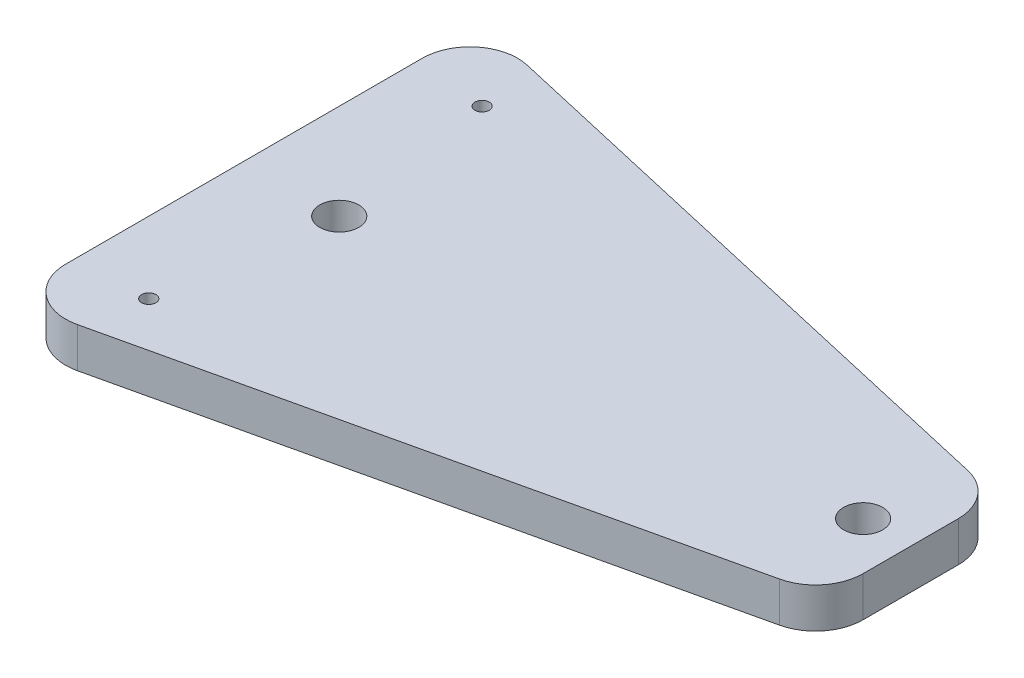
ISO-10303-21;
HEADER;
FILE_DESCRIPTION(('STEP AP214'),'2;1');
FILE_NAME('part.step','',(''),(''),'','','');
FILE_SCHEMA(('AUTOMOTIVE_DESIGN { 1 0 10303 214 1 1 1 1 }'));
ENDSEC;
DATA;
#1=APPLICATION_CONTEXT('core data for automotive mechanical design processes');
#2=APPLICATION_PROTOCOL_DEFINITION('international standard','automotive_design',2000,#1);
#3=PRODUCT_CONTEXT('',#1,'mechanical');
#4=PRODUCT('Part','Part','',(#3));
#5=PRODUCT_RELATED_PRODUCT_CATEGORY('part','',(#4));
#6=PRODUCT_DEFINITION_FORMATION('','',#4);
#7=PRODUCT_DEFINITION_CONTEXT('part definition',#1,'design');
#8=PRODUCT_DEFINITION('design','',#6,#7);
#9=PRODUCT_DEFINITION_SHAPE('','',#8);
#10=(LENGTH_UNIT() NAMED_UNIT(*) SI_UNIT(.MILLI.,.METRE.));
#11=(NAMED_UNIT(*) PLANE_ANGLE_UNIT() SI_UNIT($,.RADIAN.));
#12=(NAMED_UNIT(*) SI_UNIT($,.STERADIAN.) SOLID_ANGLE_UNIT());
#13=UNCERTAINTY_MEASURE_WITH_UNIT(LENGTH_MEASURE(1.E-05),#10,'distance_accuracy_value','');
#14=(GEOMETRIC_REPRESENTATION_CONTEXT(3) GLOBAL_UNCERTAINTY_ASSIGNED_CONTEXT((#13)) GLOBAL_UNIT_ASSIGNED_CONTEXT((#10,
#11,#12)) REPRESENTATION_CONTEXT('',''));
#15=CARTESIAN_POINT('',(0.,0.,0.));
#16=DIRECTION('',(0.,0.,1.));
#17=DIRECTION('',(1.,0.,0.));
#18=AXIS2_PLACEMENT_3D('',#15,#16,#17);
#19=CARTESIAN_POINT('',(27.0142215577712,8.4,-10.));
#20=DIRECTION('',(0.,-1.,0.));
#21=DIRECTION('',(0.,0.,-1.));
#22=AXIS2_PLACEMENT_3D('',#19,#20,#21);
#23=PLANE('',#22);
#24=CARTESIAN_POINT('',(27.0142215577712,8.4,-10.));
#25=DIRECTION('',(0.,1.,0.));
#26=DIRECTION('',(0.,0.,-1.));
#27=AXIS2_PLACEMENT_3D('',#24,#25,#26);
#28=CIRCLE('',#27,9.99999999999999);
#29=CARTESIAN_POINT('',(37.0142215577712,8.4,-10.));
#30=VERTEX_POINT('',#29);
#31=CARTESIAN_POINT('',(29.2444183072308,8.4,-19.7481394357436));
#32=VERTEX_POINT('',#31);
#33=EDGE_CURVE('E238',#30,#32,#28,.T.);
#34=ORIENTED_EDGE('',*,*,#33,.T.);
#35=DIRECTION('',(-0.974813943574362,0.,-0.223019674945958));
#36=VECTOR('',#35,1.);
#37=CARTESIAN_POINT('',(-90.7555816927692,8.4,-47.2019537455647));
#38=LINE('',#37,#36);
#39=CARTESIAN_POINT('',(-90.7555816927692,8.4,-47.2019537455647));
#40=VERTEX_POINT('',#39);
#41=EDGE_CURVE('E241',#32,#40,#38,.T.);
#42=ORIENTED_EDGE('',*,*,#41,.T.);
#43=CARTESIAN_POINT('',(-92.9857784422288,8.4,-37.453814309821));
#44=DIRECTION('',(0.,1.,0.));
#45=DIRECTION('',(0.,0.,-1.));
#46=AXIS2_PLACEMENT_3D('',#43,#44,#45);
#47=CIRCLE('',#46,10.);
#48=CARTESIAN_POINT('',(-102.985778442229,8.4,-37.453814309821));
#49=VERTEX_POINT('',#48);
#50=EDGE_CURVE('E244',#40,#49,#47,.T.);
#51=ORIENTED_EDGE('',*,*,#50,.T.);
#52=DIRECTION('',(0.,0.,1.));
#53=VECTOR('',#52,1.);
#54=CARTESIAN_POINT('',(-102.985778442229,8.4,37.453814309821));
#55=LINE('',#54,#53);
#56=CARTESIAN_POINT('',(-102.985778442229,8.4,37.453814309821));
#57=VERTEX_POINT('',#56);
#58=EDGE_CURVE('E246',#49,#57,#55,.T.);
#59=ORIENTED_EDGE('',*,*,#58,.T.);
#60=CARTESIAN_POINT('',(-92.9857784422288,8.4,37.453814309821));
#61=DIRECTION('',(0.,1.,0.));
#62=DIRECTION('',(0.,0.,-1.));
#63=AXIS2_PLACEMENT_3D('',#60,#61,#62);
#64=CIRCLE('',#63,10.);
#65=CARTESIAN_POINT('',(-90.7555816927692,8.4,47.2019537455647));
#66=VERTEX_POINT('',#65);
#67=EDGE_CURVE('E248',#57,#66,#64,.T.);
#68=ORIENTED_EDGE('',*,*,#67,.T.);
#69=DIRECTION('',(0.974813943574362,0.,-0.223019674945958));
#70=VECTOR('',#69,1.);
#71=CARTESIAN_POINT('',(-90.7555816927692,8.4,47.2019537455647));
#72=LINE('',#71,#70);
#73=CARTESIAN_POINT('',(29.2444183072308,8.4,19.7481394357436));
#74=VERTEX_POINT('',#73);
#75=EDGE_CURVE('E250',#66,#74,#72,.T.);
#76=ORIENTED_EDGE('',*,*,#75,.T.);
#77=CARTESIAN_POINT('',(27.0142215577712,8.4,10.));
#78=DIRECTION('',(0.,1.,0.));
#79=DIRECTION('',(0.,0.,1.));
#80=AXIS2_PLACEMENT_3D('',#77,#78,#79);
#81=CIRCLE('',#80,9.99999999999999);
#82=CARTESIAN_POINT('',(37.0142215577712,8.4,10.));
#83=VERTEX_POINT('',#82);
#84=EDGE_CURVE('E252',#74,#83,#81,.T.);
#85=ORIENTED_EDGE('',*,*,#84,.T.);
#86=DIRECTION('',(0.,0.,-1.));
#87=VECTOR('',#86,1.);
#88=CARTESIAN_POINT('',(37.0142215577712,8.4,10.));
#89=LINE('',#88,#87);
#90=EDGE_CURVE('E254',#83,#30,#89,.T.);
#91=ORIENTED_EDGE('',*,*,#90,.T.);
#92=EDGE_LOOP('',(#34,#42,#51,#59,#68,#76,#85,#91));
#93=FACE_BOUND('',#92,.T.);
#94=CARTESIAN_POINT('',(-82.9857784422288,8.4,0.));
#95=DIRECTION('',(0.,1.,0.));
#96=DIRECTION('',(0.,0.,1.));
#97=AXIS2_PLACEMENT_3D('',#94,#95,#96);
#98=CIRCLE('',#97,4.1);
#99=CARTESIAN_POINT('',(-82.9857784422288,8.4,4.1));
#100=VERTEX_POINT('',#99);
#101=EDGE_CURVE('E232',#100,#100,#98,.T.);
#102=ORIENTED_EDGE('',*,*,#101,.F.);
#103=EDGE_LOOP('',(#102));
#104=FACE_BOUND('',#103,.T.);
#105=CARTESIAN_POINT('',(27.0142215577712,8.4,0.));
#106=DIRECTION('',(0.,1.,0.));
#107=DIRECTION('',(0.,0.,1.));
#108=AXIS2_PLACEMENT_3D('',#105,#106,#107);
#109=CIRCLE('',#108,4.1);
#110=CARTESIAN_POINT('',(27.0142215577712,8.4,4.1));
#111=VERTEX_POINT('',#110);
#112=EDGE_CURVE('E226',#111,#111,#109,.T.);
#113=ORIENTED_EDGE('',*,*,#112,.F.);
#114=EDGE_LOOP('',(#113));
#115=FACE_BOUND('',#114,.T.);
#116=CARTESIAN_POINT('',(-87.9857784422288,8.4,35.));
#117=DIRECTION('',(0.,1.,0.));
#118=DIRECTION('',(0.,0.,1.));
#119=AXIS2_PLACEMENT_3D('',#116,#117,#118);
#120=CIRCLE('',#119,1.5);
#121=CARTESIAN_POINT('',(-87.9857784422288,8.4,36.5));
#122=VERTEX_POINT('',#121);
#123=EDGE_CURVE('E222',#122,#122,#120,.T.);
#124=ORIENTED_EDGE('',*,*,#123,.F.);
#125=EDGE_LOOP('',(#124));
#126=FACE_BOUND('',#125,.T.);
#127=CARTESIAN_POINT('',(-87.9857784422288,8.4,-35.));
#128=DIRECTION('',(0.,1.,0.));
#129=DIRECTION('',(0.,0.,1.));
#130=AXIS2_PLACEMENT_3D('',#127,#128,#129);
#131=CIRCLE('',#130,1.5);
#132=CARTESIAN_POINT('',(-87.9857784422288,8.4,-33.5));
#133=VERTEX_POINT('',#132);
#134=EDGE_CURVE('E219',#133,#133,#131,.T.);
#135=ORIENTED_EDGE('',*,*,#134,.F.);
#136=EDGE_LOOP('',(#135));
#137=FACE_BOUND('',#136,.T.);
#138=ADVANCED_FACE('F35',(#93,#104,#115,#126,#137),#23,.F.);
#139=CARTESIAN_POINT('',(27.0142215577712,0.,-10.));
#140=DIRECTION('',(0.,-1.,0.));
#141=DIRECTION('',(0.,0.,-1.));
#142=AXIS2_PLACEMENT_3D('',#139,#140,#141);
#143=PLANE('',#142);
#144=DIRECTION('',(0.,0.,1.));
#145=VECTOR('',#144,1.);
#146=CARTESIAN_POINT('',(-82.8857784422288,0.,29.9));
#147=LINE('',#146,#145);
#148=CARTESIAN_POINT('',(-82.8857784422288,0.,29.9));
#149=VERTEX_POINT('',#148);
#150=CARTESIAN_POINT('',(-82.8857784422288,0.,40.1));
#151=VERTEX_POINT('',#150);
#152=EDGE_CURVE('E52',#149,#151,#147,.T.);
#153=ORIENTED_EDGE('',*,*,#152,.F.);
#154=DIRECTION('',(1.,0.,0.));
#155=VECTOR('',#154,1.);
#156=CARTESIAN_POINT('',(-93.0857784422288,0.,29.9));
#157=LINE('',#156,#155);
#158=CARTESIAN_POINT('',(-93.0857784422288,0.,29.9));
#159=VERTEX_POINT('',#158);
#160=EDGE_CURVE('E170',#159,#149,#157,.T.);
#161=ORIENTED_EDGE('',*,*,#160,.F.);
#162=DIRECTION('',(0.,0.,-1.));
#163=VECTOR('',#162,1.);
#164=CARTESIAN_POINT('',(-93.0857784422288,0.,29.9));
#165=LINE('',#164,#163);
#166=CARTESIAN_POINT('',(-93.0857784422288,0.,40.1));
#167=VERTEX_POINT('',#166);
#168=EDGE_CURVE('E173',#167,#159,#165,.T.);
#169=ORIENTED_EDGE('',*,*,#168,.F.);
#170=DIRECTION('',(-1.,0.,0.));
#171=VECTOR('',#170,1.);
#172=CARTESIAN_POINT('',(-93.0857784422288,0.,40.1));
#173=LINE('',#172,#171);
#174=EDGE_CURVE('E179',#151,#167,#173,.T.);
#175=ORIENTED_EDGE('',*,*,#174,.F.);
#176=EDGE_LOOP('',(#153,#161,#169,#175));
#177=FACE_BOUND('',#176,.T.);
#178=DIRECTION('',(0.,0.,1.));
#179=VECTOR('',#178,1.);
#180=CARTESIAN_POINT('',(-82.8857784422288,0.,-40.1));
#181=LINE('',#180,#179);
#182=CARTESIAN_POINT('',(-82.8857784422288,0.,-40.1));
#183=VERTEX_POINT('',#182);
#184=CARTESIAN_POINT('',(-82.8857784422288,0.,-29.9));
#185=VERTEX_POINT('',#184);
#186=EDGE_CURVE('E60',#183,#185,#181,.T.);
#187=ORIENTED_EDGE('',*,*,#186,.F.);
#188=DIRECTION('',(1.,0.,0.));
#189=VECTOR('',#188,1.);
#190=CARTESIAN_POINT('',(-93.0857784422288,0.,-40.1));
#191=LINE('',#190,#189);
#192=CARTESIAN_POINT('',(-93.0857784422288,0.,-40.1));
#193=VERTEX_POINT('',#192);
#194=EDGE_CURVE('E194',#193,#183,#191,.T.);
#195=ORIENTED_EDGE('',*,*,#194,.F.);
#196=DIRECTION('',(0.,0.,-1.));
#197=VECTOR('',#196,1.);
#198=CARTESIAN_POINT('',(-93.0857784422288,0.,-40.1));
#199=LINE('',#198,#197);
#200=CARTESIAN_POINT('',(-93.0857784422288,0.,-29.9));
#201=VERTEX_POINT('',#200);
#202=EDGE_CURVE('E208',#201,#193,#199,.T.);
#203=ORIENTED_EDGE('',*,*,#202,.F.);
#204=DIRECTION('',(-1.,0.,0.));
#205=VECTOR('',#204,1.);
#206=CARTESIAN_POINT('',(-93.0857784422288,0.,-29.9));
#207=LINE('',#206,#205);
#208=EDGE_CURVE('E205',#185,#201,#207,.T.);
#209=ORIENTED_EDGE('',*,*,#208,.F.);
#210=EDGE_LOOP('',(#187,#195,#203,#209));
#211=FACE_BOUND('',#210,.T.);
#212=CARTESIAN_POINT('',(-82.9857784422288,0.,0.));
#213=DIRECTION('',(0.,1.,0.));
#214=DIRECTION('',(0.,0.,1.));
#215=AXIS2_PLACEMENT_3D('',#212,#213,#214);
#216=CIRCLE('',#215,4.1);
#217=CARTESIAN_POINT('',(-82.9857784422288,0.,4.1));
#218=VERTEX_POINT('',#217);
#219=EDGE_CURVE('E229',#218,#218,#216,.T.);
#220=ORIENTED_EDGE('',*,*,#219,.T.);
#221=EDGE_LOOP('',(#220));
#222=FACE_BOUND('',#221,.T.);
#223=CARTESIAN_POINT('',(27.0142215577712,0.,-10.));
#224=DIRECTION('',(0.,1.,0.));
#225=DIRECTION('',(0.,0.,-1.));
#226=AXIS2_PLACEMENT_3D('',#223,#224,#225);
#227=CIRCLE('',#226,9.99999999999999);
#228=CARTESIAN_POINT('',(37.0142215577712,0.,-10.));
#229=VERTEX_POINT('',#228);
#230=CARTESIAN_POINT('',(29.2444183072308,0.,-19.7481394357436));
#231=VERTEX_POINT('',#230);
#232=EDGE_CURVE('E235',#229,#231,#227,.T.);
#233=ORIENTED_EDGE('',*,*,#232,.F.);
#234=DIRECTION('',(0.,0.,-1.));
#235=VECTOR('',#234,1.);
#236=CARTESIAN_POINT('',(37.0142215577712,0.,10.));
#237=LINE('',#236,#235);
#238=CARTESIAN_POINT('',(37.0142215577712,0.,10.));
#239=VERTEX_POINT('',#238);
#240=EDGE_CURVE('E242',#239,#229,#237,.T.);
#241=ORIENTED_EDGE('',*,*,#240,.F.);
#242=CARTESIAN_POINT('',(27.0142215577712,0.,10.));
#243=DIRECTION('',(0.,1.,0.));
#244=DIRECTION('',(0.,0.,1.));
#245=AXIS2_PLACEMENT_3D('',#242,#243,#244);
#246=CIRCLE('',#245,9.99999999999999);
#247=CARTESIAN_POINT('',(29.2444183072308,0.,19.7481394357436));
#248=VERTEX_POINT('',#247);
#249=EDGE_CURVE('E269',#248,#239,#246,.T.);
#250=ORIENTED_EDGE('',*,*,#249,.F.);
#251=DIRECTION('',(0.974813943574362,0.,-0.223019674945958));
#252=VECTOR('',#251,1.);
#253=CARTESIAN_POINT('',(-90.7555816927692,0.,47.2019537455647));
#254=LINE('',#253,#252);
#255=CARTESIAN_POINT('',(-90.7555816927692,0.,47.2019537455647));
#256=VERTEX_POINT('',#255);
#257=EDGE_CURVE('E267',#256,#248,#254,.T.);
#258=ORIENTED_EDGE('',*,*,#257,.F.);
#259=CARTESIAN_POINT('',(-92.9857784422288,0.,37.453814309821));
#260=DIRECTION('',(0.,1.,0.));
#261=DIRECTION('',(0.,0.,-1.));
#262=AXIS2_PLACEMENT_3D('',#259,#260,#261);
#263=CIRCLE('',#262,10.);
#264=CARTESIAN_POINT('',(-102.985778442229,0.,37.453814309821));
#265=VERTEX_POINT('',#264);
#266=EDGE_CURVE('E265',#265,#256,#263,.T.);
#267=ORIENTED_EDGE('',*,*,#266,.F.);
#268=DIRECTION('',(0.,0.,1.));
#269=VECTOR('',#268,1.);
#270=CARTESIAN_POINT('',(-102.985778442229,0.,37.453814309821));
#271=LINE('',#270,#269);
#272=CARTESIAN_POINT('',(-102.985778442229,0.,-37.453814309821));
#273=VERTEX_POINT('',#272);
#274=EDGE_CURVE('E263',#273,#265,#271,.T.);
#275=ORIENTED_EDGE('',*,*,#274,.F.);
#276=CARTESIAN_POINT('',(-92.9857784422288,0.,-37.453814309821));
#277=DIRECTION('',(0.,1.,0.));
#278=DIRECTION('',(0.,0.,-1.));
#279=AXIS2_PLACEMENT_3D('',#276,#277,#278);
#280=CIRCLE('',#279,10.);
#281=CARTESIAN_POINT('',(-90.7555816927692,0.,-47.2019537455647));
#282=VERTEX_POINT('',#281);
#283=EDGE_CURVE('E261',#282,#273,#280,.T.);
#284=ORIENTED_EDGE('',*,*,#283,.F.);
#285=DIRECTION('',(-0.974813943574362,0.,-0.223019674945958));
#286=VECTOR('',#285,1.);
#287=CARTESIAN_POINT('',(-90.7555816927692,0.,-47.2019537455647));
#288=LINE('',#287,#286);
#289=EDGE_CURVE('E259',#231,#282,#288,.T.);
#290=ORIENTED_EDGE('',*,*,#289,.F.);
#291=EDGE_LOOP('',(#233,#241,#250,#258,#267,#275,#284,#290));
#292=FACE_BOUND('',#291,.T.);
#293=CARTESIAN_POINT('',(27.0142215577712,0.,0.));
#294=DIRECTION('',(0.,1.,0.));
#295=DIRECTION('',(0.,0.,1.));
#296=AXIS2_PLACEMENT_3D('',#293,#294,#295);
#297=CIRCLE('',#296,4.1);
#298=CARTESIAN_POINT('',(27.0142215577712,0.,4.1));
#299=VERTEX_POINT('',#298);
#300=EDGE_CURVE('E225',#299,#299,#297,.T.);
#301=ORIENTED_EDGE('',*,*,#300,.T.);
#302=EDGE_LOOP('',(#301));
#303=FACE_BOUND('',#302,.T.);
#304=ADVANCED_FACE('F307',(#177,#211,#222,#292,#303),#143,.T.);
#305=CARTESIAN_POINT('',(27.0142215577712,8.4,-10.));
#306=DIRECTION('',(0.,-1.,0.));
#307=DIRECTION('',(0.,0.,-1.));
#308=AXIS2_PLACEMENT_3D('',#305,#306,#307);
#309=CYLINDRICAL_SURFACE('',#308,9.99999999999999);
#310=ORIENTED_EDGE('',*,*,#232,.T.);
#311=DIRECTION('',(0.,-1.,0.));
#312=VECTOR('',#311,1.);
#313=CARTESIAN_POINT('',(29.2444183072308,8.4,-19.7481394357436));
#314=LINE('',#313,#312);
#315=EDGE_CURVE('E11',#32,#231,#314,.T.);
#316=ORIENTED_EDGE('',*,*,#315,.F.);
#317=ORIENTED_EDGE('',*,*,#33,.F.);
#318=DIRECTION('',(0.,-1.,0.));
#319=VECTOR('',#318,1.);
#320=CARTESIAN_POINT('',(37.0142215577712,8.4,-10.));
#321=LINE('',#320,#319);
#322=EDGE_CURVE('E256',#30,#229,#321,.T.);
#323=ORIENTED_EDGE('',*,*,#322,.T.);
#324=EDGE_LOOP('',(#310,#316,#317,#323));
#325=FACE_BOUND('',#324,.T.);
#326=ADVANCED_FACE('F37',(#325),#309,.T.);
#327=CARTESIAN_POINT('',(-90.7555816927692,8.4,-47.2019537455647));
#328=DIRECTION('',(-0.223019674945958,0.,0.974813943574362));
#329=DIRECTION('',(0.974813943574362,0.,0.223019674945958));
#330=AXIS2_PLACEMENT_3D('',#327,#328,#329);
#331=PLANE('',#330);
#332=ORIENTED_EDGE('',*,*,#289,.T.);
#333=DIRECTION('',(0.,-1.,0.));
#334=VECTOR('',#333,1.);
#335=CARTESIAN_POINT('',(-90.7555816927692,8.4,-47.2019537455647));
#336=LINE('',#335,#334);
#337=EDGE_CURVE('E44',#40,#282,#336,.T.);
#338=ORIENTED_EDGE('',*,*,#337,.F.);
#339=ORIENTED_EDGE('',*,*,#41,.F.);
#340=ORIENTED_EDGE('',*,*,#315,.T.);
#341=EDGE_LOOP('',(#332,#338,#339,#340));
#342=FACE_BOUND('',#341,.T.);
#343=ADVANCED_FACE('F355',(#342),#331,.F.);
#344=CARTESIAN_POINT('',(-92.9857784422288,8.4,-37.453814309821));
#345=DIRECTION('',(0.,-1.,0.));
#346=DIRECTION('',(0.,0.,-1.));
#347=AXIS2_PLACEMENT_3D('',#344,#345,#346);
#348=CYLINDRICAL_SURFACE('',#347,10.);
#349=ORIENTED_EDGE('',*,*,#283,.T.);
#350=DIRECTION('',(0.,-1.,0.));
#351=VECTOR('',#350,1.);
#352=CARTESIAN_POINT('',(-102.985778442229,8.4,-37.453814309821));
#353=LINE('',#352,#351);
#354=EDGE_CURVE('E286',#49,#273,#353,.T.);
#355=ORIENTED_EDGE('',*,*,#354,.F.);
#356=ORIENTED_EDGE('',*,*,#50,.F.);
#357=ORIENTED_EDGE('',*,*,#337,.T.);
#358=EDGE_LOOP('',(#349,#355,#356,#357));
#359=FACE_BOUND('',#358,.T.);
#360=ADVANCED_FACE('F352',(#359),#348,.T.);
#361=CARTESIAN_POINT('',(-102.985778442229,8.4,37.453814309821));
#362=DIRECTION('',(1.,0.,0.));
#363=DIRECTION('',(0.,0.,-1.));
#364=AXIS2_PLACEMENT_3D('',#361,#362,#363);
#365=PLANE('',#364);
#366=ORIENTED_EDGE('',*,*,#274,.T.);
#367=DIRECTION('',(0.,-1.,0.));
#368=VECTOR('',#367,1.);
#369=CARTESIAN_POINT('',(-102.985778442229,8.4,37.453814309821));
#370=LINE('',#369,#368);
#371=EDGE_CURVE('E283',#57,#265,#370,.T.);
#372=ORIENTED_EDGE('',*,*,#371,.F.);
#373=ORIENTED_EDGE('',*,*,#58,.F.);
#374=ORIENTED_EDGE('',*,*,#354,.T.);
#375=EDGE_LOOP('',(#366,#372,#373,#374));
#376=FACE_BOUND('',#375,.T.);
#377=ADVANCED_FACE('F348',(#376),#365,.F.);
#378=CARTESIAN_POINT('',(-92.9857784422288,8.4,37.453814309821));
#379=DIRECTION('',(0.,-1.,0.));
#380=DIRECTION('',(0.,0.,-1.));
#381=AXIS2_PLACEMENT_3D('',#378,#379,#380);
#382=CYLINDRICAL_SURFACE('',#381,10.);
#383=ORIENTED_EDGE('',*,*,#266,.T.);
#384=DIRECTION('',(0.,-1.,0.));
#385=VECTOR('',#384,1.);
#386=CARTESIAN_POINT('',(-90.7555816927692,8.4,47.2019537455647));
#387=LINE('',#386,#385);
#388=EDGE_CURVE('E280',#66,#256,#387,.T.);
#389=ORIENTED_EDGE('',*,*,#388,.F.);
#390=ORIENTED_EDGE('',*,*,#67,.F.);
#391=ORIENTED_EDGE('',*,*,#371,.T.);
#392=EDGE_LOOP('',(#383,#389,#390,#391));
#393=FACE_BOUND('',#392,.T.);
#394=ADVANCED_FACE('F344',(#393),#382,.T.);
#395=CARTESIAN_POINT('',(-90.7555816927692,8.4,47.2019537455647));
#396=DIRECTION('',(-0.223019674945958,0.,-0.974813943574362));
#397=DIRECTION('',(-0.974813943574362,0.,0.223019674945958));
#398=AXIS2_PLACEMENT_3D('',#395,#396,#397);
#399=PLANE('',#398);
#400=ORIENTED_EDGE('',*,*,#257,.T.);
#401=DIRECTION('',(0.,-1.,0.));
#402=VECTOR('',#401,1.);
#403=CARTESIAN_POINT('',(29.2444183072308,8.4,19.7481394357436));
#404=LINE('',#403,#402);
#405=EDGE_CURVE('E277',#74,#248,#404,.T.);
#406=ORIENTED_EDGE('',*,*,#405,.F.);
#407=ORIENTED_EDGE('',*,*,#75,.F.);
#408=ORIENTED_EDGE('',*,*,#388,.T.);
#409=EDGE_LOOP('',(#400,#406,#407,#408));
#410=FACE_BOUND('',#409,.T.);
#411=ADVANCED_FACE('F340',(#410),#399,.F.);
#412=CARTESIAN_POINT('',(27.0142215577712,8.4,10.));
#413=DIRECTION('',(0.,-1.,0.));
#414=DIRECTION('',(0.,0.,-1.));
#415=AXIS2_PLACEMENT_3D('',#412,#413,#414);
#416=CYLINDRICAL_SURFACE('',#415,9.99999999999999);
#417=ORIENTED_EDGE('',*,*,#249,.T.);
#418=DIRECTION('',(0.,-1.,0.));
#419=VECTOR('',#418,1.);
#420=CARTESIAN_POINT('',(37.0142215577712,8.4,10.));
#421=LINE('',#420,#419);
#422=EDGE_CURVE('E274',#83,#239,#421,.T.);
#423=ORIENTED_EDGE('',*,*,#422,.F.);
#424=ORIENTED_EDGE('',*,*,#84,.F.);
#425=ORIENTED_EDGE('',*,*,#405,.T.);
#426=EDGE_LOOP('',(#417,#423,#424,#425));
#427=FACE_BOUND('',#426,.T.);
#428=ADVANCED_FACE('F336',(#427),#416,.T.);
#429=CARTESIAN_POINT('',(37.0142215577712,8.4,10.));
#430=DIRECTION('',(-1.,0.,0.));
#431=DIRECTION('',(0.,0.,1.));
#432=AXIS2_PLACEMENT_3D('',#429,#430,#431);
#433=PLANE('',#432);
#434=ORIENTED_EDGE('',*,*,#240,.T.);
#435=ORIENTED_EDGE('',*,*,#322,.F.);
#436=ORIENTED_EDGE('',*,*,#90,.F.);
#437=ORIENTED_EDGE('',*,*,#422,.T.);
#438=EDGE_LOOP('',(#434,#435,#436,#437));
#439=FACE_BOUND('',#438,.T.);
#440=ADVANCED_FACE('F328',(#439),#433,.F.);
#441=CARTESIAN_POINT('',(-82.9857784422288,8.4,0.));
#442=DIRECTION('',(0.,-1.,0.));
#443=DIRECTION('',(0.,0.,-1.));
#444=AXIS2_PLACEMENT_3D('',#441,#442,#443);
#445=CYLINDRICAL_SURFACE('',#444,4.1);
#446=ORIENTED_EDGE('',*,*,#101,.T.);
#447=EDGE_LOOP('',(#446));
#448=FACE_BOUND('',#447,.T.);
#449=ORIENTED_EDGE('',*,*,#219,.F.);
#450=EDGE_LOOP('',(#449));
#451=FACE_BOUND('',#450,.T.);
#452=ADVANCED_FACE('F325',(#448,#451),#445,.F.);
#453=CARTESIAN_POINT('',(27.0142215577712,8.4,0.));
#454=DIRECTION('',(0.,-1.,0.));
#455=DIRECTION('',(0.,0.,-1.));
#456=AXIS2_PLACEMENT_3D('',#453,#454,#455);
#457=CYLINDRICAL_SURFACE('',#456,4.1);
#458=ORIENTED_EDGE('',*,*,#112,.T.);
#459=EDGE_LOOP('',(#458));
#460=FACE_BOUND('',#459,.T.);
#461=ORIENTED_EDGE('',*,*,#300,.F.);
#462=EDGE_LOOP('',(#461));
#463=FACE_BOUND('',#462,.T.);
#464=ADVANCED_FACE('F301',(#460,#463),#457,.F.);
#465=CARTESIAN_POINT('',(-87.9857784422288,8.4,35.));
#466=DIRECTION('',(0.,-1.,0.));
#467=DIRECTION('',(0.,0.,-1.));
#468=AXIS2_PLACEMENT_3D('',#465,#466,#467);
#469=CYLINDRICAL_SURFACE('',#468,1.5);
#470=CARTESIAN_POINT('',(-87.9857784422288,5.,35.));
#471=DIRECTION('',(0.,1.,0.));
#472=DIRECTION('',(0.,0.,1.));
#473=AXIS2_PLACEMENT_3D('',#470,#471,#472);
#474=CIRCLE('',#473,1.5);
#475=CARTESIAN_POINT('',(-87.9857784422288,5.,36.5));
#476=VERTEX_POINT('',#475);
#477=EDGE_CURVE('E39',#476,#476,#474,.T.);
#478=ORIENTED_EDGE('',*,*,#477,.F.);
#479=EDGE_LOOP('',(#478));
#480=FACE_BOUND('',#479,.T.);
#481=ORIENTED_EDGE('',*,*,#123,.T.);
#482=EDGE_LOOP('',(#481));
#483=FACE_BOUND('',#482,.T.);
#484=ADVANCED_FACE('F297',(#480,#483),#469,.F.);
#485=CARTESIAN_POINT('',(-87.9857784422288,8.4,-35.));
#486=DIRECTION('',(0.,-1.,0.));
#487=DIRECTION('',(0.,0.,-1.));
#488=AXIS2_PLACEMENT_3D('',#485,#486,#487);
#489=CYLINDRICAL_SURFACE('',#488,1.5);
#490=CARTESIAN_POINT('',(-87.9857784422288,5.,-35.));
#491=DIRECTION('',(0.,1.,0.));
#492=DIRECTION('',(0.,0.,1.));
#493=AXIS2_PLACEMENT_3D('',#490,#491,#492);
#494=CIRCLE('',#493,1.5);
#495=CARTESIAN_POINT('',(-87.9857784422288,5.,-33.5));
#496=VERTEX_POINT('',#495);
#497=EDGE_CURVE('E186',#496,#496,#494,.T.);
#498=ORIENTED_EDGE('',*,*,#497,.F.);
#499=EDGE_LOOP('',(#498));
#500=FACE_BOUND('',#499,.T.);
#501=ORIENTED_EDGE('',*,*,#134,.T.);
#502=EDGE_LOOP('',(#501));
#503=FACE_BOUND('',#502,.T.);
#504=ADVANCED_FACE('F300',(#500,#503),#489,.F.);
#505=CARTESIAN_POINT('',(-82.8857784422288,5.,-40.1));
#506=DIRECTION('',(1.,0.,0.));
#507=DIRECTION('',(0.,0.,-1.));
#508=AXIS2_PLACEMENT_3D('',#505,#506,#507);
#509=PLANE('',#508);
#510=ORIENTED_EDGE('',*,*,#186,.T.);
#511=DIRECTION('',(0.,-1.,0.));
#512=VECTOR('',#511,1.);
#513=CARTESIAN_POINT('',(-82.8857784422288,5.,-29.9));
#514=LINE('',#513,#512);
#515=CARTESIAN_POINT('',(-82.8857784422288,5.,-29.9));
#516=VERTEX_POINT('',#515);
#517=EDGE_CURVE('E203',#516,#185,#514,.T.);
#518=ORIENTED_EDGE('',*,*,#517,.F.);
#519=DIRECTION('',(0.,0.,1.));
#520=VECTOR('',#519,1.);
#521=CARTESIAN_POINT('',(-82.8857784422288,5.,-40.1));
#522=LINE('',#521,#520);
#523=CARTESIAN_POINT('',(-82.8857784422288,5.,-40.1));
#524=VERTEX_POINT('',#523);
#525=EDGE_CURVE('E190',#524,#516,#522,.T.);
#526=ORIENTED_EDGE('',*,*,#525,.F.);
#527=DIRECTION('',(0.,-1.,0.));
#528=VECTOR('',#527,1.);
#529=CARTESIAN_POINT('',(-82.8857784422288,5.,-40.1));
#530=LINE('',#529,#528);
#531=EDGE_CURVE('E180',#524,#183,#530,.T.);
#532=ORIENTED_EDGE('',*,*,#531,.T.);
#533=EDGE_LOOP('',(#510,#518,#526,#532));
#534=FACE_BOUND('',#533,.T.);
#535=ADVANCED_FACE('F313',(#534),#509,.F.);
#536=CARTESIAN_POINT('',(-93.0857784422288,5.,-40.1));
#537=DIRECTION('',(0.,0.,-1.));
#538=DIRECTION('',(-1.,0.,0.));
#539=AXIS2_PLACEMENT_3D('',#536,#537,#538);
#540=PLANE('',#539);
#541=ORIENTED_EDGE('',*,*,#194,.T.);
#542=ORIENTED_EDGE('',*,*,#531,.F.);
#543=DIRECTION('',(1.,0.,0.));
#544=VECTOR('',#543,1.);
#545=CARTESIAN_POINT('',(-93.0857784422288,5.,-40.1));
#546=LINE('',#545,#544);
#547=CARTESIAN_POINT('',(-93.0857784422288,5.,-40.1));
#548=VERTEX_POINT('',#547);
#549=EDGE_CURVE('E200',#548,#524,#546,.T.);
#550=ORIENTED_EDGE('',*,*,#549,.F.);
#551=DIRECTION('',(0.,-1.,0.));
#552=VECTOR('',#551,1.);
#553=CARTESIAN_POINT('',(-93.0857784422288,5.,-40.1));
#554=LINE('',#553,#552);
#555=EDGE_CURVE('E214',#548,#193,#554,.T.);
#556=ORIENTED_EDGE('',*,*,#555,.T.);
#557=EDGE_LOOP('',(#541,#542,#550,#556));
#558=FACE_BOUND('',#557,.T.);
#559=ADVANCED_FACE('F319',(#558),#540,.F.);
#560=CARTESIAN_POINT('',(-93.0857784422288,5.,-40.1));
#561=DIRECTION('',(-1.,0.,0.));
#562=DIRECTION('',(0.,0.,1.));
#563=AXIS2_PLACEMENT_3D('',#560,#561,#562);
#564=PLANE('',#563);
#565=ORIENTED_EDGE('',*,*,#202,.T.);
#566=ORIENTED_EDGE('',*,*,#555,.F.);
#567=DIRECTION('',(0.,0.,-1.));
#568=VECTOR('',#567,1.);
#569=CARTESIAN_POINT('',(-93.0857784422288,5.,-40.1));
#570=LINE('',#569,#568);
#571=CARTESIAN_POINT('',(-93.0857784422288,5.,-29.9));
#572=VERTEX_POINT('',#571);
#573=EDGE_CURVE('E197',#572,#548,#570,.T.);
#574=ORIENTED_EDGE('',*,*,#573,.F.);
#575=DIRECTION('',(0.,-1.,0.));
#576=VECTOR('',#575,1.);
#577=CARTESIAN_POINT('',(-93.0857784422288,5.,-29.9));
#578=LINE('',#577,#576);
#579=EDGE_CURVE('E216',#572,#201,#578,.T.);
#580=ORIENTED_EDGE('',*,*,#579,.T.);
#581=EDGE_LOOP('',(#565,#566,#574,#580));
#582=FACE_BOUND('',#581,.T.);
#583=ADVANCED_FACE('F478',(#582),#564,.F.);
#584=CARTESIAN_POINT('',(-93.0857784422288,5.,-29.9));
#585=DIRECTION('',(0.,0.,1.));
#586=DIRECTION('',(1.,0.,0.));
#587=AXIS2_PLACEMENT_3D('',#584,#585,#586);
#588=PLANE('',#587);
#589=ORIENTED_EDGE('',*,*,#208,.T.);
#590=ORIENTED_EDGE('',*,*,#579,.F.);
#591=DIRECTION('',(-1.,0.,0.));
#592=VECTOR('',#591,1.);
#593=CARTESIAN_POINT('',(-93.0857784422288,5.,-29.9));
#594=LINE('',#593,#592);
#595=EDGE_CURVE('E193',#516,#572,#594,.T.);
#596=ORIENTED_EDGE('',*,*,#595,.F.);
#597=ORIENTED_EDGE('',*,*,#517,.T.);
#598=EDGE_LOOP('',(#589,#590,#596,#597));
#599=FACE_BOUND('',#598,.T.);
#600=ADVANCED_FACE('F487',(#599),#588,.F.);
#601=CARTESIAN_POINT('',(0.,5.,0.));
#602=DIRECTION('',(0.,1.,0.));
#603=DIRECTION('',(0.,0.,1.));
#604=AXIS2_PLACEMENT_3D('',#601,#602,#603);
#605=PLANE('',#604);
#606=ORIENTED_EDGE('',*,*,#497,.T.);
#607=EDGE_LOOP('',(#606));
#608=FACE_BOUND('',#607,.T.);
#609=ORIENTED_EDGE('',*,*,#525,.T.);
#610=ORIENTED_EDGE('',*,*,#595,.T.);
#611=ORIENTED_EDGE('',*,*,#573,.T.);
#612=ORIENTED_EDGE('',*,*,#549,.T.);
#613=EDGE_LOOP('',(#609,#610,#611,#612));
#614=FACE_BOUND('',#613,.T.);
#615=ADVANCED_FACE('F496',(#608,#614),#605,.F.);
#616=CARTESIAN_POINT('',(-82.8857784422288,5.,29.9));
#617=DIRECTION('',(1.,0.,0.));
#618=DIRECTION('',(0.,0.,-1.));
#619=AXIS2_PLACEMENT_3D('',#616,#617,#618);
#620=PLANE('',#619);
#621=ORIENTED_EDGE('',*,*,#152,.T.);
#622=DIRECTION('',(0.,-1.,0.));
#623=VECTOR('',#622,1.);
#624=CARTESIAN_POINT('',(-82.8857784422288,5.,40.1));
#625=LINE('',#624,#623);
#626=CARTESIAN_POINT('',(-82.8857784422288,5.,40.1));
#627=VERTEX_POINT('',#626);
#628=EDGE_CURVE('E148',#627,#151,#625,.T.);
#629=ORIENTED_EDGE('',*,*,#628,.F.);
#630=DIRECTION('',(0.,0.,1.));
#631=VECTOR('',#630,1.);
#632=CARTESIAN_POINT('',(-82.8857784422288,5.,29.9));
#633=LINE('',#632,#631);
#634=CARTESIAN_POINT('',(-82.8857784422288,5.,29.9));
#635=VERTEX_POINT('',#634);
#636=EDGE_CURVE('E152',#635,#627,#633,.T.);
#637=ORIENTED_EDGE('',*,*,#636,.F.);
#638=DIRECTION('',(0.,-1.,0.));
#639=VECTOR('',#638,1.);
#640=CARTESIAN_POINT('',(-82.8857784422288,5.,29.9));
#641=LINE('',#640,#639);
#642=EDGE_CURVE('E184',#635,#149,#641,.T.);
#643=ORIENTED_EDGE('',*,*,#642,.T.);
#644=EDGE_LOOP('',(#621,#629,#637,#643));
#645=FACE_BOUND('',#644,.T.);
#646=ADVANCED_FACE('F150',(#645),#620,.F.);
#647=CARTESIAN_POINT('',(-93.0857784422288,5.,29.9));
#648=DIRECTION('',(0.,0.,-1.));
#649=DIRECTION('',(-1.,0.,0.));
#650=AXIS2_PLACEMENT_3D('',#647,#648,#649);
#651=PLANE('',#650);
#652=ORIENTED_EDGE('',*,*,#160,.T.);
#653=ORIENTED_EDGE('',*,*,#642,.F.);
#654=DIRECTION('',(1.,0.,0.));
#655=VECTOR('',#654,1.);
#656=CARTESIAN_POINT('',(-93.0857784422288,5.,29.9));
#657=LINE('',#656,#655);
#658=CARTESIAN_POINT('',(-93.0857784422288,5.,29.9));
#659=VERTEX_POINT('',#658);
#660=EDGE_CURVE('E158',#659,#635,#657,.T.);
#661=ORIENTED_EDGE('',*,*,#660,.F.);
#662=DIRECTION('',(0.,-1.,0.));
#663=VECTOR('',#662,1.);
#664=CARTESIAN_POINT('',(-93.0857784422288,5.,29.9));
#665=LINE('',#664,#663);
#666=EDGE_CURVE('E187',#659,#159,#665,.T.);
#667=ORIENTED_EDGE('',*,*,#666,.T.);
#668=EDGE_LOOP('',(#652,#653,#661,#667));
#669=FACE_BOUND('',#668,.T.);
#670=ADVANCED_FACE('F511',(#669),#651,.F.);
#671=CARTESIAN_POINT('',(-93.0857784422288,5.,29.9));
#672=DIRECTION('',(-1.,0.,0.));
#673=DIRECTION('',(0.,0.,1.));
#674=AXIS2_PLACEMENT_3D('',#671,#672,#673);
#675=PLANE('',#674);
#676=ORIENTED_EDGE('',*,*,#168,.T.);
#677=ORIENTED_EDGE('',*,*,#666,.F.);
#678=DIRECTION('',(0.,0.,-1.));
#679=VECTOR('',#678,1.);
#680=CARTESIAN_POINT('',(-93.0857784422288,5.,29.9));
#681=LINE('',#680,#679);
#682=CARTESIAN_POINT('',(-93.0857784422288,5.,40.1));
#683=VERTEX_POINT('',#682);
#684=EDGE_CURVE('E166',#683,#659,#681,.T.);
#685=ORIENTED_EDGE('',*,*,#684,.F.);
#686=DIRECTION('',(0.,-1.,0.));
#687=VECTOR('',#686,1.);
#688=CARTESIAN_POINT('',(-93.0857784422288,5.,40.1));
#689=LINE('',#688,#687);
#690=EDGE_CURVE('E157',#683,#167,#689,.T.);
#691=ORIENTED_EDGE('',*,*,#690,.T.);
#692=EDGE_LOOP('',(#676,#677,#685,#691));
#693=FACE_BOUND('',#692,.T.);
#694=ADVANCED_FACE('F519',(#693),#675,.F.);
#695=CARTESIAN_POINT('',(-93.0857784422288,5.,40.1));
#696=DIRECTION('',(0.,0.,1.));
#697=DIRECTION('',(1.,0.,0.));
#698=AXIS2_PLACEMENT_3D('',#695,#696,#697);
#699=PLANE('',#698);
#700=ORIENTED_EDGE('',*,*,#174,.T.);
#701=ORIENTED_EDGE('',*,*,#690,.F.);
#702=DIRECTION('',(-1.,0.,0.));
#703=VECTOR('',#702,1.);
#704=CARTESIAN_POINT('',(-93.0857784422288,5.,40.1));
#705=LINE('',#704,#703);
#706=EDGE_CURVE('E161',#627,#683,#705,.T.);
#707=ORIENTED_EDGE('',*,*,#706,.F.);
#708=ORIENTED_EDGE('',*,*,#628,.T.);
#709=EDGE_LOOP('',(#700,#701,#707,#708));
#710=FACE_BOUND('',#709,.T.);
#711=ADVANCED_FACE('F162',(#710),#699,.F.);
#712=CARTESIAN_POINT('',(0.,5.,0.));
#713=DIRECTION('',(0.,1.,0.));
#714=DIRECTION('',(0.,0.,1.));
#715=AXIS2_PLACEMENT_3D('',#712,#713,#714);
#716=PLANE('',#715);
#717=ORIENTED_EDGE('',*,*,#477,.T.);
#718=EDGE_LOOP('',(#717));
#719=FACE_BOUND('',#718,.T.);
#720=ORIENTED_EDGE('',*,*,#636,.T.);
#721=ORIENTED_EDGE('',*,*,#706,.T.);
#722=ORIENTED_EDGE('',*,*,#684,.T.);
#723=ORIENTED_EDGE('',*,*,#660,.T.);
#724=EDGE_LOOP('',(#720,#721,#722,#723));
#725=FACE_BOUND('',#724,.T.);
#726=ADVANCED_FACE('F168',(#719,#725),#716,.F.);
#727=CLOSED_SHELL('',(#138,#304,#326,#343,#360,#377,#394,#411,#428,#440,#452,#464,#484,#504,
#535,#559,#583,#600,#615,#646,#670,#694,#711,#726));
#728=MANIFOLD_SOLID_BREP('B2',#727);
#729=ADVANCED_BREP_SHAPE_REPRESENTATION('',(#18,#728),#14);
#730=SHAPE_DEFINITION_REPRESENTATION(#9,#729);
ENDSEC;
END-ISO-10303-21;
